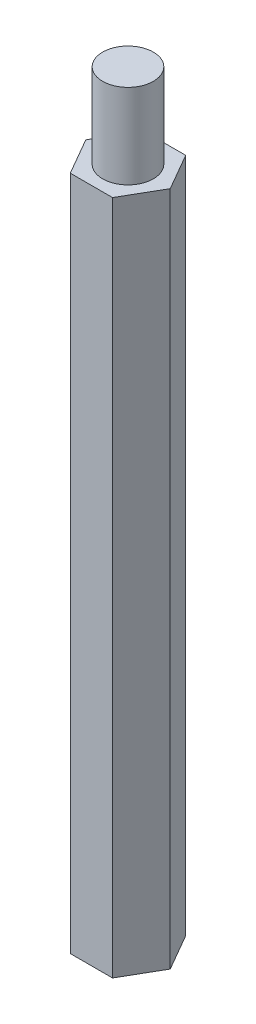
ISO-10303-21;
HEADER;
FILE_DESCRIPTION(('STEP AP214'),'2;1');
FILE_NAME('part.step','',(''),(''),'','','');
FILE_SCHEMA(('AUTOMOTIVE_DESIGN { 1 0 10303 214 1 1 1 1 }'));
ENDSEC;
DATA;
#1=APPLICATION_CONTEXT('core data for automotive mechanical design processes');
#2=APPLICATION_PROTOCOL_DEFINITION('international standard','automotive_design',2000,#1);
#3=PRODUCT_CONTEXT('',#1,'mechanical');
#4=PRODUCT('Part','Part','',(#3));
#5=PRODUCT_RELATED_PRODUCT_CATEGORY('part','',(#4));
#6=PRODUCT_DEFINITION_FORMATION('','',#4);
#7=PRODUCT_DEFINITION_CONTEXT('part definition',#1,'design');
#8=PRODUCT_DEFINITION('design','',#6,#7);
#9=PRODUCT_DEFINITION_SHAPE('','',#8);
#10=(LENGTH_UNIT() NAMED_UNIT(*) SI_UNIT(.MILLI.,.METRE.));
#11=(NAMED_UNIT(*) PLANE_ANGLE_UNIT() SI_UNIT($,.RADIAN.));
#12=(NAMED_UNIT(*) SI_UNIT($,.STERADIAN.) SOLID_ANGLE_UNIT());
#13=UNCERTAINTY_MEASURE_WITH_UNIT(LENGTH_MEASURE(1.E-05),#10,'distance_accuracy_value','');
#14=(GEOMETRIC_REPRESENTATION_CONTEXT(3) GLOBAL_UNCERTAINTY_ASSIGNED_CONTEXT((#13)) GLOBAL_UNIT_ASSIGNED_CONTEXT((#10,
#11,#12)) REPRESENTATION_CONTEXT('',''));
#15=CARTESIAN_POINT('',(0.,0.,0.));
#16=DIRECTION('',(0.,0.,1.));
#17=DIRECTION('',(1.,0.,0.));
#18=AXIS2_PLACEMENT_3D('',#15,#16,#17);
#19=CARTESIAN_POINT('',(0.,40.,0.));
#20=DIRECTION('',(0.,1.,0.));
#21=DIRECTION('',(0.,0.,1.));
#22=AXIS2_PLACEMENT_3D('',#19,#20,#21);
#23=PLANE('',#22);
#24=DIRECTION('',(1.,0.,0.));
#25=VECTOR('',#24,1.);
#26=CARTESIAN_POINT('',(-1.25,40.,2.1650635094611));
#27=LINE('',#26,#25);
#28=CARTESIAN_POINT('',(-1.25,40.,2.1650635094611));
#29=VERTEX_POINT('',#28);
#30=CARTESIAN_POINT('',(1.25,40.,2.1650635094611));
#31=VERTEX_POINT('',#30);
#32=EDGE_CURVE('E129',#29,#31,#27,.T.);
#33=ORIENTED_EDGE('',*,*,#32,.T.);
#34=DIRECTION('',(0.5,0.,-0.866025403784439));
#35=VECTOR('',#34,1.);
#36=CARTESIAN_POINT('',(1.25,40.,2.1650635094611));
#37=LINE('',#36,#35);
#38=CARTESIAN_POINT('',(2.5,40.,0.));
#39=VERTEX_POINT('',#38);
#40=EDGE_CURVE('E87',#31,#39,#37,.T.);
#41=ORIENTED_EDGE('',*,*,#40,.T.);
#42=DIRECTION('',(-0.499999999999999,0.,-0.866025403784439));
#43=VECTOR('',#42,1.);
#44=CARTESIAN_POINT('',(2.5,40.,0.));
#45=LINE('',#44,#43);
#46=CARTESIAN_POINT('',(1.25,40.,-2.1650635094611));
#47=VERTEX_POINT('',#46);
#48=EDGE_CURVE('E100',#39,#47,#45,.T.);
#49=ORIENTED_EDGE('',*,*,#48,.T.);
#50=DIRECTION('',(-1.,0.,0.));
#51=VECTOR('',#50,1.);
#52=CARTESIAN_POINT('',(1.25,40.,-2.1650635094611));
#53=LINE('',#52,#51);
#54=CARTESIAN_POINT('',(-1.25,40.,-2.1650635094611));
#55=VERTEX_POINT('',#54);
#56=EDGE_CURVE('E94',#47,#55,#53,.T.);
#57=ORIENTED_EDGE('',*,*,#56,.T.);
#58=DIRECTION('',(-0.5,0.,0.866025403784438));
#59=VECTOR('',#58,1.);
#60=CARTESIAN_POINT('',(-1.25,40.,-2.1650635094611));
#61=LINE('',#60,#59);
#62=CARTESIAN_POINT('',(-2.5,40.,0.));
#63=VERTEX_POINT('',#62);
#64=EDGE_CURVE('E98',#55,#63,#61,.T.);
#65=ORIENTED_EDGE('',*,*,#64,.T.);
#66=DIRECTION('',(0.499999999999999,0.,0.866025403784439));
#67=VECTOR('',#66,1.);
#68=CARTESIAN_POINT('',(-2.5,40.,0.));
#69=LINE('',#68,#67);
#70=EDGE_CURVE('E50',#63,#29,#69,.T.);
#71=ORIENTED_EDGE('',*,*,#70,.T.);
#72=EDGE_LOOP('',(#33,#41,#49,#57,#65,#71));
#73=FACE_BOUND('',#72,.T.);
#74=CARTESIAN_POINT('',(0.,40.,0.));
#75=DIRECTION('',(0.,1.,0.));
#76=DIRECTION('',(0.,0.,1.));
#77=AXIS2_PLACEMENT_3D('',#74,#75,#76);
#78=CIRCLE('',#77,1.5);
#79=CARTESIAN_POINT('',(0.,40.,1.5));
#80=VERTEX_POINT('',#79);
#81=EDGE_CURVE('E179',#80,#80,#78,.T.);
#82=ORIENTED_EDGE('',*,*,#81,.F.);
#83=EDGE_LOOP('',(#82));
#84=FACE_BOUND('',#83,.T.);
#85=ADVANCED_FACE('F33',(#73,#84),#23,.T.);
#86=CARTESIAN_POINT('',(-1.25,40.,2.1650635094611));
#87=DIRECTION('',(0.,0.,-1.));
#88=DIRECTION('',(-1.,0.,0.));
#89=AXIS2_PLACEMENT_3D('',#86,#87,#88);
#90=PLANE('',#89);
#91=DIRECTION('',(1.,0.,0.));
#92=VECTOR('',#91,1.);
#93=CARTESIAN_POINT('',(-1.25,0.,2.1650635094611));
#94=LINE('',#93,#92);
#95=CARTESIAN_POINT('',(-1.25,0.,2.1650635094611));
#96=VERTEX_POINT('',#95);
#97=CARTESIAN_POINT('',(1.25,0.,2.1650635094611));
#98=VERTEX_POINT('',#97);
#99=EDGE_CURVE('E118',#96,#98,#94,.T.);
#100=ORIENTED_EDGE('',*,*,#99,.T.);
#101=DIRECTION('',(0.,-1.,0.));
#102=VECTOR('',#101,1.);
#103=CARTESIAN_POINT('',(1.25,40.,2.1650635094611));
#104=LINE('',#103,#102);
#105=EDGE_CURVE('E11',#31,#98,#104,.T.);
#106=ORIENTED_EDGE('',*,*,#105,.F.);
#107=ORIENTED_EDGE('',*,*,#32,.F.);
#108=DIRECTION('',(0.,-1.,0.));
#109=VECTOR('',#108,1.);
#110=CARTESIAN_POINT('',(-1.25,40.,2.1650635094611));
#111=LINE('',#110,#109);
#112=EDGE_CURVE('E114',#29,#96,#111,.T.);
#113=ORIENTED_EDGE('',*,*,#112,.T.);
#114=EDGE_LOOP('',(#100,#106,#107,#113));
#115=FACE_BOUND('',#114,.T.);
#116=ADVANCED_FACE('F35',(#115),#90,.F.);
#117=CARTESIAN_POINT('',(1.25,40.,2.1650635094611));
#118=DIRECTION('',(-0.866025403784439,0.,-0.5));
#119=DIRECTION('',(-0.5,0.,0.866025403784439));
#120=AXIS2_PLACEMENT_3D('',#117,#118,#119);
#121=PLANE('',#120);
#122=DIRECTION('',(0.5,0.,-0.866025403784439));
#123=VECTOR('',#122,1.);
#124=CARTESIAN_POINT('',(1.25,0.,2.1650635094611));
#125=LINE('',#124,#123);
#126=CARTESIAN_POINT('',(2.5,0.,0.));
#127=VERTEX_POINT('',#126);
#128=EDGE_CURVE('E121',#98,#127,#125,.T.);
#129=ORIENTED_EDGE('',*,*,#128,.T.);
#130=DIRECTION('',(0.,-1.,0.));
#131=VECTOR('',#130,1.);
#132=CARTESIAN_POINT('',(2.5,40.,0.));
#133=LINE('',#132,#131);
#134=EDGE_CURVE('E42',#39,#127,#133,.T.);
#135=ORIENTED_EDGE('',*,*,#134,.F.);
#136=ORIENTED_EDGE('',*,*,#40,.F.);
#137=ORIENTED_EDGE('',*,*,#105,.T.);
#138=EDGE_LOOP('',(#129,#135,#136,#137));
#139=FACE_BOUND('',#138,.T.);
#140=ADVANCED_FACE('F158',(#139),#121,.F.);
#141=CARTESIAN_POINT('',(2.5,40.,0.));
#142=DIRECTION('',(-0.866025403784439,0.,0.499999999999999));
#143=DIRECTION('',(0.499999999999999,0.,0.866025403784439));
#144=AXIS2_PLACEMENT_3D('',#141,#142,#143);
#145=PLANE('',#144);
#146=DIRECTION('',(-0.499999999999999,0.,-0.866025403784439));
#147=VECTOR('',#146,1.);
#148=CARTESIAN_POINT('',(2.5,0.,0.));
#149=LINE('',#148,#147);
#150=CARTESIAN_POINT('',(1.25,0.,-2.1650635094611));
#151=VERTEX_POINT('',#150);
#152=EDGE_CURVE('E124',#127,#151,#149,.T.);
#153=ORIENTED_EDGE('',*,*,#152,.T.);
#154=DIRECTION('',(0.,-1.,0.));
#155=VECTOR('',#154,1.);
#156=CARTESIAN_POINT('',(1.25,40.,-2.1650635094611));
#157=LINE('',#156,#155);
#158=EDGE_CURVE('E109',#47,#151,#157,.T.);
#159=ORIENTED_EDGE('',*,*,#158,.F.);
#160=ORIENTED_EDGE('',*,*,#48,.F.);
#161=ORIENTED_EDGE('',*,*,#134,.T.);
#162=EDGE_LOOP('',(#153,#159,#160,#161));
#163=FACE_BOUND('',#162,.T.);
#164=ADVANCED_FACE('F135',(#163),#145,.F.);
#165=CARTESIAN_POINT('',(1.25,40.,-2.1650635094611));
#166=DIRECTION('',(0.,0.,1.));
#167=DIRECTION('',(1.,0.,0.));
#168=AXIS2_PLACEMENT_3D('',#165,#166,#167);
#169=PLANE('',#168);
#170=DIRECTION('',(-1.,0.,0.));
#171=VECTOR('',#170,1.);
#172=CARTESIAN_POINT('',(1.25,0.,-2.1650635094611));
#173=LINE('',#172,#171);
#174=CARTESIAN_POINT('',(-1.25,0.,-2.1650635094611));
#175=VERTEX_POINT('',#174);
#176=EDGE_CURVE('E108',#151,#175,#173,.T.);
#177=ORIENTED_EDGE('',*,*,#176,.T.);
#178=DIRECTION('',(0.,-1.,0.));
#179=VECTOR('',#178,1.);
#180=CARTESIAN_POINT('',(-1.25,40.,-2.1650635094611));
#181=LINE('',#180,#179);
#182=EDGE_CURVE('E105',#55,#175,#181,.T.);
#183=ORIENTED_EDGE('',*,*,#182,.F.);
#184=ORIENTED_EDGE('',*,*,#56,.F.);
#185=ORIENTED_EDGE('',*,*,#158,.T.);
#186=EDGE_LOOP('',(#177,#183,#184,#185));
#187=FACE_BOUND('',#186,.T.);
#188=ADVANCED_FACE('F106',(#187),#169,.F.);
#189=CARTESIAN_POINT('',(-1.25,40.,-2.1650635094611));
#190=DIRECTION('',(0.866025403784438,0.,0.5));
#191=DIRECTION('',(0.500000000000001,0.,-0.866025403784438));
#192=AXIS2_PLACEMENT_3D('',#189,#190,#191);
#193=PLANE('',#192);
#194=DIRECTION('',(-0.5,0.,0.866025403784438));
#195=VECTOR('',#194,1.);
#196=CARTESIAN_POINT('',(-1.25,0.,-2.1650635094611));
#197=LINE('',#196,#195);
#198=CARTESIAN_POINT('',(-2.5,0.,0.));
#199=VERTEX_POINT('',#198);
#200=EDGE_CURVE('E73',#175,#199,#197,.T.);
#201=ORIENTED_EDGE('',*,*,#200,.T.);
#202=DIRECTION('',(0.,-1.,0.));
#203=VECTOR('',#202,1.);
#204=CARTESIAN_POINT('',(-2.5,40.,0.));
#205=LINE('',#204,#203);
#206=EDGE_CURVE('E110',#63,#199,#205,.T.);
#207=ORIENTED_EDGE('',*,*,#206,.F.);
#208=ORIENTED_EDGE('',*,*,#64,.F.);
#209=ORIENTED_EDGE('',*,*,#182,.T.);
#210=EDGE_LOOP('',(#201,#207,#208,#209));
#211=FACE_BOUND('',#210,.T.);
#212=ADVANCED_FACE('F112',(#211),#193,.F.);
#213=CARTESIAN_POINT('',(-2.5,40.,0.));
#214=DIRECTION('',(0.866025403784439,0.,-0.499999999999999));
#215=DIRECTION('',(-0.499999999999999,0.,-0.866025403784439));
#216=AXIS2_PLACEMENT_3D('',#213,#214,#215);
#217=PLANE('',#216);
#218=DIRECTION('',(0.499999999999999,0.,0.866025403784439));
#219=VECTOR('',#218,1.);
#220=CARTESIAN_POINT('',(-2.5,0.,0.));
#221=LINE('',#220,#219);
#222=EDGE_CURVE('E79',#199,#96,#221,.T.);
#223=ORIENTED_EDGE('',*,*,#222,.T.);
#224=ORIENTED_EDGE('',*,*,#112,.F.);
#225=ORIENTED_EDGE('',*,*,#70,.F.);
#226=ORIENTED_EDGE('',*,*,#206,.T.);
#227=EDGE_LOOP('',(#223,#224,#225,#226));
#228=FACE_BOUND('',#227,.T.);
#229=ADVANCED_FACE('F142',(#228),#217,.F.);
#230=CARTESIAN_POINT('',(0.,0.,0.));
#231=DIRECTION('',(0.,1.,0.));
#232=DIRECTION('',(0.,0.,1.));
#233=AXIS2_PLACEMENT_3D('',#230,#231,#232);
#234=PLANE('',#233);
#235=CARTESIAN_POINT('',(0.,0.,0.));
#236=DIRECTION('',(0.,-1.,0.));
#237=DIRECTION('',(0.,0.,-1.));
#238=AXIS2_PLACEMENT_3D('',#235,#236,#237);
#239=CIRCLE('',#238,1.5);
#240=CARTESIAN_POINT('',(0.,0.,-1.5));
#241=VERTEX_POINT('',#240);
#242=EDGE_CURVE('E180',#241,#241,#239,.T.);
#243=ORIENTED_EDGE('',*,*,#242,.F.);
#244=EDGE_LOOP('',(#243));
#245=FACE_BOUND('',#244,.T.);
#246=ORIENTED_EDGE('',*,*,#99,.F.);
#247=ORIENTED_EDGE('',*,*,#222,.F.);
#248=ORIENTED_EDGE('',*,*,#200,.F.);
#249=ORIENTED_EDGE('',*,*,#176,.F.);
#250=ORIENTED_EDGE('',*,*,#152,.F.);
#251=ORIENTED_EDGE('',*,*,#128,.F.);
#252=EDGE_LOOP('',(#246,#247,#248,#249,#250,#251));
#253=FACE_BOUND('',#252,.T.);
#254=ADVANCED_FACE('F138',(#245,#253),#234,.F.);
#255=CARTESIAN_POINT('',(0.,45.,0.));
#256=DIRECTION('',(0.,-1.,0.));
#257=DIRECTION('',(0.,0.,-1.));
#258=AXIS2_PLACEMENT_3D('',#255,#256,#257);
#259=CYLINDRICAL_SURFACE('',#258,1.5);
#260=CARTESIAN_POINT('',(0.,45.,0.));
#261=DIRECTION('',(0.,1.,0.));
#262=DIRECTION('',(0.,0.,1.));
#263=AXIS2_PLACEMENT_3D('',#260,#261,#262);
#264=CIRCLE('',#263,1.5);
#265=CARTESIAN_POINT('',(0.,45.,1.5));
#266=VERTEX_POINT('',#265);
#267=EDGE_CURVE('E122',#266,#266,#264,.T.);
#268=ORIENTED_EDGE('',*,*,#267,.F.);
#269=EDGE_LOOP('',(#268));
#270=FACE_BOUND('',#269,.T.);
#271=ORIENTED_EDGE('',*,*,#81,.T.);
#272=EDGE_LOOP('',(#271));
#273=FACE_BOUND('',#272,.T.);
#274=ADVANCED_FACE('F149',(#270,#273),#259,.T.);
#275=CARTESIAN_POINT('',(0.,45.,0.));
#276=DIRECTION('',(0.,1.,0.));
#277=DIRECTION('',(0.,0.,1.));
#278=AXIS2_PLACEMENT_3D('',#275,#276,#277);
#279=PLANE('',#278);
#280=ORIENTED_EDGE('',*,*,#267,.T.);
#281=EDGE_LOOP('',(#280));
#282=FACE_BOUND('',#281,.T.);
#283=ADVANCED_FACE('F162',(#282),#279,.T.);
#284=CARTESIAN_POINT('',(0.,10.,0.));
#285=DIRECTION('',(0.,-1.,0.));
#286=DIRECTION('',(0.,0.,-1.));
#287=AXIS2_PLACEMENT_3D('',#284,#285,#286);
#288=CYLINDRICAL_SURFACE('',#287,1.5);
#289=CARTESIAN_POINT('',(0.,10.,0.));
#290=DIRECTION('',(0.,-1.,0.));
#291=DIRECTION('',(0.,0.,-1.));
#292=AXIS2_PLACEMENT_3D('',#289,#290,#291);
#293=CIRCLE('',#292,1.5);
#294=CARTESIAN_POINT('',(0.,10.,-1.5));
#295=VERTEX_POINT('',#294);
#296=EDGE_CURVE('E178',#295,#295,#293,.T.);
#297=ORIENTED_EDGE('',*,*,#296,.F.);
#298=EDGE_LOOP('',(#297));
#299=FACE_BOUND('',#298,.T.);
#300=ORIENTED_EDGE('',*,*,#242,.T.);
#301=EDGE_LOOP('',(#300));
#302=FACE_BOUND('',#301,.T.);
#303=ADVANCED_FACE('F166',(#299,#302),#288,.F.);
#304=CARTESIAN_POINT('',(0.,10.,0.));
#305=DIRECTION('',(0.,-1.,0.));
#306=DIRECTION('',(0.,0.,-1.));
#307=AXIS2_PLACEMENT_3D('',#304,#305,#306);
#308=PLANE('',#307);
#309=ORIENTED_EDGE('',*,*,#296,.T.);
#310=EDGE_LOOP('',(#309));
#311=FACE_BOUND('',#310,.T.);
#312=ADVANCED_FACE('F170',(#311),#308,.T.);
#313=CLOSED_SHELL('',(#85,#116,#140,#164,#188,#212,#229,#254,#274,#283,#303,#312));
#314=MANIFOLD_SOLID_BREP('B2',#313);
#315=ADVANCED_BREP_SHAPE_REPRESENTATION('',(#18,#314),#14);
#316=SHAPE_DEFINITION_REPRESENTATION(#9,#315);
ENDSEC;
END-ISO-10303-21;
